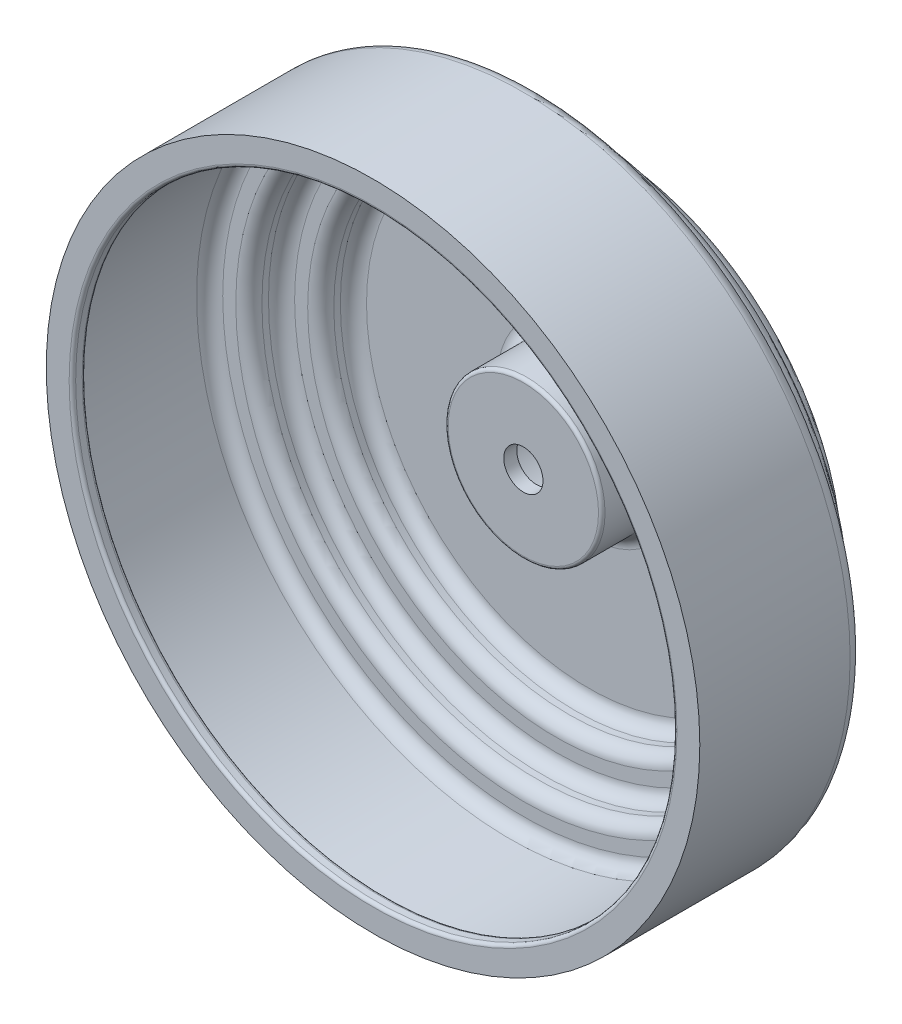
ISO-10303-21;
HEADER;
FILE_DESCRIPTION(('STEP AP214'),'2;1');
FILE_NAME('part.step','',(''),(''),'','','');
FILE_SCHEMA(('AUTOMOTIVE_DESIGN { 1 0 10303 214 1 1 1 1 }'));
ENDSEC;
DATA;
#1=APPLICATION_CONTEXT('core data for automotive mechanical design processes');
#2=APPLICATION_PROTOCOL_DEFINITION('international standard','automotive_design',2000,#1);
#3=PRODUCT_CONTEXT('',#1,'mechanical');
#4=PRODUCT('Part','Part','',(#3));
#5=PRODUCT_RELATED_PRODUCT_CATEGORY('part','',(#4));
#6=PRODUCT_DEFINITION_FORMATION('','',#4);
#7=PRODUCT_DEFINITION_CONTEXT('part definition',#1,'design');
#8=PRODUCT_DEFINITION('design','',#6,#7);
#9=PRODUCT_DEFINITION_SHAPE('','',#8);
#10=(LENGTH_UNIT() NAMED_UNIT(*) SI_UNIT(.MILLI.,.METRE.));
#11=(NAMED_UNIT(*) PLANE_ANGLE_UNIT() SI_UNIT($,.RADIAN.));
#12=(NAMED_UNIT(*) SI_UNIT($,.STERADIAN.) SOLID_ANGLE_UNIT());
#13=UNCERTAINTY_MEASURE_WITH_UNIT(LENGTH_MEASURE(1.E-05),#10,'distance_accuracy_value','');
#14=(GEOMETRIC_REPRESENTATION_CONTEXT(3) GLOBAL_UNCERTAINTY_ASSIGNED_CONTEXT((#13)) GLOBAL_UNIT_ASSIGNED_CONTEXT((#10,
#11,#12)) REPRESENTATION_CONTEXT('',''));
#15=CARTESIAN_POINT('',(0.,0.,0.));
#16=DIRECTION('',(0.,0.,1.));
#17=DIRECTION('',(1.,0.,0.));
#18=AXIS2_PLACEMENT_3D('',#15,#16,#17);
#19=CARTESIAN_POINT('',(0.,-50.,35.));
#20=DIRECTION('',(0.,0.,1.));
#21=DIRECTION('',(1.,0.,0.));
#22=AXIS2_PLACEMENT_3D('',#19,#20,#21);
#23=PLANE('',#22);
#24=CARTESIAN_POINT('',(0.,0.,35.));
#25=DIRECTION('',(0.,0.,1.));
#26=DIRECTION('',(1.,0.,0.));
#27=AXIS2_PLACEMENT_3D('',#24,#25,#26);
#28=CIRCLE('',#27,46.5);
#29=CARTESIAN_POINT('',(46.5,0.,35.));
#30=VERTEX_POINT('',#29);
#31=EDGE_CURVE('E10',#30,#30,#28,.F.);
#32=ORIENTED_EDGE('',*,*,#31,.T.);
#33=EDGE_LOOP('',(#32));
#34=FACE_BOUND('',#33,.T.);
#35=CARTESIAN_POINT('',(0.,0.,35.));
#36=DIRECTION('',(0.,0.,1.));
#37=DIRECTION('',(1.,0.,0.));
#38=AXIS2_PLACEMENT_3D('',#35,#36,#37);
#39=CIRCLE('',#38,50.);
#40=CARTESIAN_POINT('',(50.,0.,35.));
#41=VERTEX_POINT('',#40);
#42=EDGE_CURVE('E149',#41,#41,#39,.T.);
#43=ORIENTED_EDGE('',*,*,#42,.T.);
#44=EDGE_LOOP('',(#43));
#45=FACE_BOUND('',#44,.T.);
#46=ADVANCED_FACE('F39',(#34,#45),#23,.T.);
#47=CARTESIAN_POINT('',(0.,0.,39.2664757959795));
#48=DIRECTION('',(0.,0.,1.));
#49=DIRECTION('',(1.,0.,0.));
#50=AXIS2_PLACEMENT_3D('',#47,#48,#49);
#51=CYLINDRICAL_SURFACE('',#50,46.);
#52=CARTESIAN_POINT('',(0.,0.,33.5));
#53=DIRECTION('',(0.,0.,-1.));
#54=DIRECTION('',(-1.,0.,0.));
#55=AXIS2_PLACEMENT_3D('',#52,#53,#54);
#56=CIRCLE('',#55,46.);
#57=CARTESIAN_POINT('',(-46.,0.,33.5));
#58=VERTEX_POINT('',#57);
#59=EDGE_CURVE('E53',#58,#58,#56,.T.);
#60=ORIENTED_EDGE('',*,*,#59,.T.);
#61=EDGE_LOOP('',(#60));
#62=FACE_BOUND('',#61,.T.);
#63=CARTESIAN_POINT('',(0.,0.,34.5));
#64=DIRECTION('',(0.,0.,1.));
#65=DIRECTION('',(1.,0.,0.));
#66=AXIS2_PLACEMENT_3D('',#63,#64,#65);
#67=CIRCLE('',#66,46.);
#68=CARTESIAN_POINT('',(46.,0.,34.5));
#69=VERTEX_POINT('',#68);
#70=EDGE_CURVE('E56',#69,#69,#67,.T.);
#71=ORIENTED_EDGE('',*,*,#70,.T.);
#72=EDGE_LOOP('',(#71));
#73=FACE_BOUND('',#72,.T.);
#74=ADVANCED_FACE('F172',(#62,#73),#51,.F.);
#75=CARTESIAN_POINT('',(0.,-46.,33.));
#76=DIRECTION('',(0.,0.,-1.));
#77=DIRECTION('',(-1.,0.,0.));
#78=AXIS2_PLACEMENT_3D('',#75,#76,#77);
#79=PLANE('',#78);
#80=CARTESIAN_POINT('',(0.,0.,33.));
#81=DIRECTION('',(0.,0.,-1.));
#82=DIRECTION('',(-1.,0.,0.));
#83=AXIS2_PLACEMENT_3D('',#80,#81,#82);
#84=CIRCLE('',#83,46.5);
#85=CARTESIAN_POINT('',(-46.5,0.,33.));
#86=VERTEX_POINT('',#85);
#87=EDGE_CURVE('E65',#86,#86,#84,.F.);
#88=ORIENTED_EDGE('',*,*,#87,.T.);
#89=EDGE_LOOP('',(#88));
#90=FACE_BOUND('',#89,.T.);
#91=CARTESIAN_POINT('',(0.,0.,33.));
#92=DIRECTION('',(0.,0.,1.));
#93=DIRECTION('',(1.,0.,0.));
#94=AXIS2_PLACEMENT_3D('',#91,#92,#93);
#95=CIRCLE('',#94,48.);
#96=CARTESIAN_POINT('',(48.,0.,33.));
#97=VERTEX_POINT('',#96);
#98=EDGE_CURVE('E140',#97,#97,#95,.T.);
#99=ORIENTED_EDGE('',*,*,#98,.F.);
#100=EDGE_LOOP('',(#99));
#101=FACE_BOUND('',#100,.T.);
#102=ADVANCED_FACE('F180',(#90,#101),#79,.T.);
#103=CARTESIAN_POINT('',(0.,0.,39.2664757959795));
#104=DIRECTION('',(0.,0.,1.));
#105=DIRECTION('',(1.,0.,0.));
#106=AXIS2_PLACEMENT_3D('',#103,#104,#105);
#107=CYLINDRICAL_SURFACE('',#106,48.);
#108=CARTESIAN_POINT('',(0.,0.,14.));
#109=DIRECTION('',(0.,0.,1.));
#110=DIRECTION('',(1.,0.,0.));
#111=AXIS2_PLACEMENT_3D('',#108,#109,#110);
#112=CIRCLE('',#111,48.);
#113=CARTESIAN_POINT('',(48.,0.,14.));
#114=VERTEX_POINT('',#113);
#115=EDGE_CURVE('E90',#114,#114,#112,.F.);
#116=ORIENTED_EDGE('',*,*,#115,.T.);
#117=EDGE_LOOP('',(#116));
#118=FACE_BOUND('',#117,.T.);
#119=ORIENTED_EDGE('',*,*,#98,.T.);
#120=EDGE_LOOP('',(#119));
#121=FACE_BOUND('',#120,.T.);
#122=ADVANCED_FACE('F289',(#118,#121),#107,.F.);
#123=CARTESIAN_POINT('',(0.,-48.,12.));
#124=DIRECTION('',(0.,0.,1.));
#125=DIRECTION('',(1.,0.,0.));
#126=AXIS2_PLACEMENT_3D('',#123,#124,#125);
#127=PLANE('',#126);
#128=CARTESIAN_POINT('',(0.,0.,12.));
#129=DIRECTION('',(0.,0.,1.));
#130=DIRECTION('',(1.,0.,0.));
#131=AXIS2_PLACEMENT_3D('',#128,#129,#130);
#132=CIRCLE('',#131,46.);
#133=CARTESIAN_POINT('',(46.,0.,12.));
#134=VERTEX_POINT('',#133);
#135=EDGE_CURVE('E95',#134,#134,#132,.T.);
#136=ORIENTED_EDGE('',*,*,#135,.T.);
#137=EDGE_LOOP('',(#136));
#138=FACE_BOUND('',#137,.T.);
#139=CARTESIAN_POINT('',(0.,0.,12.));
#140=DIRECTION('',(0.,0.,1.));
#141=DIRECTION('',(1.,0.,0.));
#142=AXIS2_PLACEMENT_3D('',#139,#140,#141);
#143=CIRCLE('',#142,44.);
#144=CARTESIAN_POINT('',(44.,0.,12.));
#145=VERTEX_POINT('',#144);
#146=EDGE_CURVE('E92',#145,#145,#143,.F.);
#147=ORIENTED_EDGE('',*,*,#146,.T.);
#148=EDGE_LOOP('',(#147));
#149=FACE_BOUND('',#148,.T.);
#150=ADVANCED_FACE('F286',(#138,#149),#127,.T.);
#151=CARTESIAN_POINT('',(0.,0.,39.2664757959795));
#152=DIRECTION('',(0.,0.,1.));
#153=DIRECTION('',(1.,0.,0.));
#154=AXIS2_PLACEMENT_3D('',#151,#152,#153);
#155=CYLINDRICAL_SURFACE('',#154,42.);
#156=CARTESIAN_POINT('',(0.,0.,10.));
#157=DIRECTION('',(0.,0.,1.));
#158=DIRECTION('',(1.,0.,0.));
#159=AXIS2_PLACEMENT_3D('',#156,#157,#158);
#160=CIRCLE('',#159,42.);
#161=CARTESIAN_POINT('',(42.,0.,10.));
#162=VERTEX_POINT('',#161);
#163=EDGE_CURVE('E83',#162,#162,#160,.T.);
#164=ORIENTED_EDGE('',*,*,#163,.T.);
#165=EDGE_LOOP('',(#164));
#166=FACE_BOUND('',#165,.T.);
#167=CARTESIAN_POINT('',(0.,0.,8.99999999999999));
#168=DIRECTION('',(0.,0.,1.));
#169=DIRECTION('',(1.,0.,0.));
#170=AXIS2_PLACEMENT_3D('',#167,#168,#169);
#171=CIRCLE('',#170,42.);
#172=CARTESIAN_POINT('',(42.,0.,8.99999999999999));
#173=VERTEX_POINT('',#172);
#174=EDGE_CURVE('E88',#173,#173,#171,.F.);
#175=ORIENTED_EDGE('',*,*,#174,.T.);
#176=EDGE_LOOP('',(#175));
#177=FACE_BOUND('',#176,.T.);
#178=ADVANCED_FACE('F285',(#166,#177),#155,.F.);
#179=CARTESIAN_POINT('',(0.,-42.,6.99999999999999));
#180=DIRECTION('',(0.,0.,1.));
#181=DIRECTION('',(1.,0.,0.));
#182=AXIS2_PLACEMENT_3D('',#179,#180,#181);
#183=PLANE('',#182);
#184=CARTESIAN_POINT('',(0.,0.,6.99999999999999));
#185=DIRECTION('',(0.,0.,1.));
#186=DIRECTION('',(1.,0.,0.));
#187=AXIS2_PLACEMENT_3D('',#184,#185,#186);
#188=CIRCLE('',#187,40.);
#189=CARTESIAN_POINT('',(40.,0.,6.99999999999999));
#190=VERTEX_POINT('',#189);
#191=EDGE_CURVE('E80',#190,#190,#188,.T.);
#192=ORIENTED_EDGE('',*,*,#191,.T.);
#193=EDGE_LOOP('',(#192));
#194=FACE_BOUND('',#193,.T.);
#195=CARTESIAN_POINT('',(0.,0.,6.99999999999999));
#196=DIRECTION('',(0.,0.,1.));
#197=DIRECTION('',(1.,0.,0.));
#198=AXIS2_PLACEMENT_3D('',#195,#196,#197);
#199=CIRCLE('',#198,38.);
#200=CARTESIAN_POINT('',(38.,0.,6.99999999999999));
#201=VERTEX_POINT('',#200);
#202=EDGE_CURVE('E76',#201,#201,#199,.F.);
#203=ORIENTED_EDGE('',*,*,#202,.T.);
#204=EDGE_LOOP('',(#203));
#205=FACE_BOUND('',#204,.T.);
#206=ADVANCED_FACE('F279',(#194,#205),#183,.T.);
#207=CARTESIAN_POINT('',(0.,0.,39.2664757959795));
#208=DIRECTION('',(0.,0.,1.));
#209=DIRECTION('',(1.,0.,0.));
#210=AXIS2_PLACEMENT_3D('',#207,#208,#209);
#211=CYLINDRICAL_SURFACE('',#210,36.);
#212=CARTESIAN_POINT('',(0.,0.,5.));
#213=DIRECTION('',(0.,0.,1.));
#214=DIRECTION('',(1.,0.,0.));
#215=AXIS2_PLACEMENT_3D('',#212,#213,#214);
#216=CIRCLE('',#215,36.);
#217=CARTESIAN_POINT('',(36.,0.,5.));
#218=VERTEX_POINT('',#217);
#219=EDGE_CURVE('E72',#218,#218,#216,.T.);
#220=ORIENTED_EDGE('',*,*,#219,.T.);
#221=EDGE_LOOP('',(#220));
#222=FACE_BOUND('',#221,.T.);
#223=CARTESIAN_POINT('',(0.,0.,4.));
#224=DIRECTION('',(0.,0.,1.));
#225=DIRECTION('',(1.,0.,0.));
#226=AXIS2_PLACEMENT_3D('',#223,#224,#225);
#227=CIRCLE('',#226,36.);
#228=CARTESIAN_POINT('',(36.,0.,4.));
#229=VERTEX_POINT('',#228);
#230=EDGE_CURVE('E74',#229,#229,#227,.F.);
#231=ORIENTED_EDGE('',*,*,#230,.T.);
#232=EDGE_LOOP('',(#231));
#233=FACE_BOUND('',#232,.T.);
#234=ADVANCED_FACE('F273',(#222,#233),#211,.F.);
#235=CARTESIAN_POINT('',(0.,-36.,2.));
#236=DIRECTION('',(0.,0.,1.));
#237=DIRECTION('',(1.,0.,0.));
#238=AXIS2_PLACEMENT_3D('',#235,#236,#237);
#239=PLANE('',#238);
#240=CARTESIAN_POINT('',(0.,0.,2.));
#241=DIRECTION('',(0.,0.,1.));
#242=DIRECTION('',(1.,0.,0.));
#243=AXIS2_PLACEMENT_3D('',#240,#241,#242);
#244=CIRCLE('',#243,14.);
#245=CARTESIAN_POINT('',(14.,0.,2.));
#246=VERTEX_POINT('',#245);
#247=EDGE_CURVE('E126',#246,#246,#244,.F.);
#248=ORIENTED_EDGE('',*,*,#247,.T.);
#249=EDGE_LOOP('',(#248));
#250=FACE_BOUND('',#249,.T.);
#251=CARTESIAN_POINT('',(0.,0.,2.));
#252=DIRECTION('',(0.,0.,1.));
#253=DIRECTION('',(1.,0.,0.));
#254=AXIS2_PLACEMENT_3D('',#251,#252,#253);
#255=CIRCLE('',#254,34.);
#256=CARTESIAN_POINT('',(34.,0.,2.));
#257=VERTEX_POINT('',#256);
#258=EDGE_CURVE('E132',#257,#257,#255,.T.);
#259=ORIENTED_EDGE('',*,*,#258,.T.);
#260=EDGE_LOOP('',(#259));
#261=FACE_BOUND('',#260,.T.);
#262=ADVANCED_FACE('F271',(#250,#261),#239,.T.);
#263=CARTESIAN_POINT('',(0.,0.,39.2664757959795));
#264=DIRECTION('',(0.,0.,1.));
#265=DIRECTION('',(1.,0.,0.));
#266=AXIS2_PLACEMENT_3D('',#263,#264,#265);
#267=CYLINDRICAL_SURFACE('',#266,12.);
#268=CARTESIAN_POINT('',(0.,0.,11.5));
#269=DIRECTION('',(0.,0.,1.));
#270=DIRECTION('',(1.,0.,0.));
#271=AXIS2_PLACEMENT_3D('',#268,#269,#270);
#272=CIRCLE('',#271,12.);
#273=CARTESIAN_POINT('',(12.,0.,11.5));
#274=VERTEX_POINT('',#273);
#275=EDGE_CURVE('E46',#274,#274,#272,.F.);
#276=ORIENTED_EDGE('',*,*,#275,.T.);
#277=EDGE_LOOP('',(#276));
#278=FACE_BOUND('',#277,.T.);
#279=CARTESIAN_POINT('',(0.,0.,4.));
#280=DIRECTION('',(0.,0.,1.));
#281=DIRECTION('',(1.,0.,0.));
#282=AXIS2_PLACEMENT_3D('',#279,#280,#281);
#283=CIRCLE('',#282,12.);
#284=CARTESIAN_POINT('',(12.,0.,4.));
#285=VERTEX_POINT('',#284);
#286=EDGE_CURVE('E134',#285,#285,#283,.T.);
#287=ORIENTED_EDGE('',*,*,#286,.T.);
#288=EDGE_LOOP('',(#287));
#289=FACE_BOUND('',#288,.T.);
#290=ADVANCED_FACE('F242',(#278,#289),#267,.T.);
#291=CARTESIAN_POINT('',(0.,-12.,12.));
#292=DIRECTION('',(0.,0.,1.));
#293=DIRECTION('',(1.,0.,0.));
#294=AXIS2_PLACEMENT_3D('',#291,#292,#293);
#295=PLANE('',#294);
#296=CARTESIAN_POINT('',(0.,0.,12.));
#297=DIRECTION('',(0.,0.,1.));
#298=DIRECTION('',(1.,0.,0.));
#299=AXIS2_PLACEMENT_3D('',#296,#297,#298);
#300=CIRCLE('',#299,11.5);
#301=CARTESIAN_POINT('',(11.5,0.,12.));
#302=VERTEX_POINT('',#301);
#303=EDGE_CURVE('E49',#302,#302,#300,.T.);
#304=ORIENTED_EDGE('',*,*,#303,.T.);
#305=EDGE_LOOP('',(#304));
#306=FACE_BOUND('',#305,.T.);
#307=CARTESIAN_POINT('',(0.,0.,12.));
#308=DIRECTION('',(0.,0.,1.));
#309=DIRECTION('',(1.,0.,0.));
#310=AXIS2_PLACEMENT_3D('',#307,#308,#309);
#311=CIRCLE('',#310,3.);
#312=CARTESIAN_POINT('',(3.,0.,12.));
#313=VERTEX_POINT('',#312);
#314=EDGE_CURVE('E139',#313,#313,#311,.T.);
#315=ORIENTED_EDGE('',*,*,#314,.F.);
#316=EDGE_LOOP('',(#315));
#317=FACE_BOUND('',#316,.T.);
#318=ADVANCED_FACE('F240',(#306,#317),#295,.T.);
#319=CARTESIAN_POINT('',(0.,0.,39.2664757959795));
#320=DIRECTION('',(0.,0.,1.));
#321=DIRECTION('',(1.,0.,0.));
#322=AXIS2_PLACEMENT_3D('',#319,#320,#321);
#323=CYLINDRICAL_SURFACE('',#322,3.);
#324=ORIENTED_EDGE('',*,*,#314,.T.);
#325=EDGE_LOOP('',(#324));
#326=FACE_BOUND('',#325,.T.);
#327=CARTESIAN_POINT('',(0.,0.,10.));
#328=DIRECTION('',(0.,0.,1.));
#329=DIRECTION('',(1.,0.,0.));
#330=AXIS2_PLACEMENT_3D('',#327,#328,#329);
#331=CIRCLE('',#330,3.);
#332=CARTESIAN_POINT('',(3.,0.,10.));
#333=VERTEX_POINT('',#332);
#334=EDGE_CURVE('E141',#333,#333,#331,.T.);
#335=ORIENTED_EDGE('',*,*,#334,.F.);
#336=EDGE_LOOP('',(#335));
#337=FACE_BOUND('',#336,.T.);
#338=ADVANCED_FACE('F238',(#326,#337),#323,.F.);
#339=CARTESIAN_POINT('',(0.,-9.99999999999999,10.));
#340=DIRECTION('',(0.,0.,-1.));
#341=DIRECTION('',(-1.,0.,0.));
#342=AXIS2_PLACEMENT_3D('',#339,#340,#341);
#343=PLANE('',#342);
#344=ORIENTED_EDGE('',*,*,#334,.T.);
#345=EDGE_LOOP('',(#344));
#346=FACE_BOUND('',#345,.T.);
#347=CARTESIAN_POINT('',(0.,0.,10.));
#348=DIRECTION('',(0.,0.,1.));
#349=DIRECTION('',(1.,0.,0.));
#350=AXIS2_PLACEMENT_3D('',#347,#348,#349);
#351=CIRCLE('',#350,9.99999999999999);
#352=CARTESIAN_POINT('',(9.99999999999999,0.,10.));
#353=VERTEX_POINT('',#352);
#354=EDGE_CURVE('E148',#353,#353,#351,.T.);
#355=ORIENTED_EDGE('',*,*,#354,.F.);
#356=EDGE_LOOP('',(#355));
#357=FACE_BOUND('',#356,.T.);
#358=ADVANCED_FACE('F250',(#346,#357),#343,.T.);
#359=CARTESIAN_POINT('',(0.,0.,39.2664757959795));
#360=DIRECTION('',(0.,0.,1.));
#361=DIRECTION('',(1.,0.,0.));
#362=AXIS2_PLACEMENT_3D('',#359,#360,#361);
#363=CYLINDRICAL_SURFACE('',#362,9.99999999999999);
#364=CARTESIAN_POINT('',(0.,0.,0.5));
#365=DIRECTION('',(0.,0.,-1.));
#366=DIRECTION('',(-1.,0.,0.));
#367=AXIS2_PLACEMENT_3D('',#364,#365,#366);
#368=CIRCLE('',#367,9.99999999999999);
#369=CARTESIAN_POINT('',(-9.99999999999999,0.,0.5));
#370=VERTEX_POINT('',#369);
#371=EDGE_CURVE('E61',#370,#370,#368,.T.);
#372=ORIENTED_EDGE('',*,*,#371,.T.);
#373=EDGE_LOOP('',(#372));
#374=FACE_BOUND('',#373,.T.);
#375=ORIENTED_EDGE('',*,*,#354,.T.);
#376=EDGE_LOOP('',(#375));
#377=FACE_BOUND('',#376,.T.);
#378=ADVANCED_FACE('F251',(#374,#377),#363,.F.);
#379=CARTESIAN_POINT('',(0.,-38.,0.));
#380=DIRECTION('',(0.,0.,-1.));
#381=DIRECTION('',(-1.,0.,0.));
#382=AXIS2_PLACEMENT_3D('',#379,#380,#381);
#383=PLANE('',#382);
#384=CARTESIAN_POINT('',(0.,0.,0.));
#385=DIRECTION('',(0.,0.,-1.));
#386=DIRECTION('',(-1.,0.,0.));
#387=AXIS2_PLACEMENT_3D('',#384,#385,#386);
#388=CIRCLE('',#387,10.5);
#389=CARTESIAN_POINT('',(-10.5,0.,0.));
#390=VERTEX_POINT('',#389);
#391=EDGE_CURVE('E68',#390,#390,#388,.F.);
#392=ORIENTED_EDGE('',*,*,#391,.T.);
#393=EDGE_LOOP('',(#392));
#394=FACE_BOUND('',#393,.T.);
#395=CARTESIAN_POINT('',(0.,0.,0.));
#396=DIRECTION('',(0.,0.,-1.));
#397=DIRECTION('',(-1.,0.,0.));
#398=AXIS2_PLACEMENT_3D('',#395,#396,#397);
#399=CIRCLE('',#398,36.);
#400=CARTESIAN_POINT('',(-36.,0.,0.));
#401=VERTEX_POINT('',#400);
#402=EDGE_CURVE('E98',#401,#401,#399,.T.);
#403=ORIENTED_EDGE('',*,*,#402,.T.);
#404=EDGE_LOOP('',(#403));
#405=FACE_BOUND('',#404,.T.);
#406=ADVANCED_FACE('F256',(#394,#405),#383,.T.);
#407=CARTESIAN_POINT('',(0.,0.,39.2664757959795));
#408=DIRECTION('',(0.,0.,1.));
#409=DIRECTION('',(1.,0.,0.));
#410=AXIS2_PLACEMENT_3D('',#407,#408,#409);
#411=CYLINDRICAL_SURFACE('',#410,38.);
#412=CARTESIAN_POINT('',(0.,0.,3.));
#413=DIRECTION('',(0.,0.,-1.));
#414=DIRECTION('',(-1.,0.,0.));
#415=AXIS2_PLACEMENT_3D('',#412,#413,#414);
#416=CIRCLE('',#415,38.);
#417=CARTESIAN_POINT('',(-38.,0.,3.));
#418=VERTEX_POINT('',#417);
#419=EDGE_CURVE('E101',#418,#418,#416,.T.);
#420=ORIENTED_EDGE('',*,*,#419,.T.);
#421=EDGE_LOOP('',(#420));
#422=FACE_BOUND('',#421,.T.);
#423=CARTESIAN_POINT('',(0.,0.,2.));
#424=DIRECTION('',(0.,0.,-1.));
#425=DIRECTION('',(-1.,0.,0.));
#426=AXIS2_PLACEMENT_3D('',#423,#424,#425);
#427=CIRCLE('',#426,38.);
#428=CARTESIAN_POINT('',(-38.,0.,2.));
#429=VERTEX_POINT('',#428);
#430=EDGE_CURVE('E102',#429,#429,#427,.F.);
#431=ORIENTED_EDGE('',*,*,#430,.T.);
#432=EDGE_LOOP('',(#431));
#433=FACE_BOUND('',#432,.T.);
#434=ADVANCED_FACE('F262',(#422,#433),#411,.T.);
#435=CARTESIAN_POINT('',(0.,-44.,5.));
#436=DIRECTION('',(0.,0.,-1.));
#437=DIRECTION('',(-1.,0.,0.));
#438=AXIS2_PLACEMENT_3D('',#435,#436,#437);
#439=PLANE('',#438);
#440=CARTESIAN_POINT('',(0.,0.,5.));
#441=DIRECTION('',(0.,0.,-1.));
#442=DIRECTION('',(-1.,0.,0.));
#443=AXIS2_PLACEMENT_3D('',#440,#441,#442);
#444=CIRCLE('',#443,42.);
#445=CARTESIAN_POINT('',(-42.,0.,5.));
#446=VERTEX_POINT('',#445);
#447=EDGE_CURVE('E110',#446,#446,#444,.T.);
#448=ORIENTED_EDGE('',*,*,#447,.T.);
#449=EDGE_LOOP('',(#448));
#450=FACE_BOUND('',#449,.T.);
#451=CARTESIAN_POINT('',(0.,0.,5.));
#452=DIRECTION('',(0.,0.,-1.));
#453=DIRECTION('',(-1.,0.,0.));
#454=AXIS2_PLACEMENT_3D('',#451,#452,#453);
#455=CIRCLE('',#454,40.);
#456=CARTESIAN_POINT('',(-40.,0.,5.));
#457=VERTEX_POINT('',#456);
#458=EDGE_CURVE('E109',#457,#457,#455,.F.);
#459=ORIENTED_EDGE('',*,*,#458,.T.);
#460=EDGE_LOOP('',(#459));
#461=FACE_BOUND('',#460,.T.);
#462=ADVANCED_FACE('F349',(#450,#461),#439,.T.);
#463=CARTESIAN_POINT('',(0.,0.,39.2664757959795));
#464=DIRECTION('',(0.,0.,1.));
#465=DIRECTION('',(1.,0.,0.));
#466=AXIS2_PLACEMENT_3D('',#463,#464,#465);
#467=CYLINDRICAL_SURFACE('',#466,44.);
#468=CARTESIAN_POINT('',(0.,0.,7.99999999999999));
#469=DIRECTION('',(0.,0.,-1.));
#470=DIRECTION('',(-1.,0.,0.));
#471=AXIS2_PLACEMENT_3D('',#468,#469,#470);
#472=CIRCLE('',#471,44.);
#473=CARTESIAN_POINT('',(-44.,0.,7.99999999999999));
#474=VERTEX_POINT('',#473);
#475=EDGE_CURVE('E114',#474,#474,#472,.T.);
#476=ORIENTED_EDGE('',*,*,#475,.T.);
#477=EDGE_LOOP('',(#476));
#478=FACE_BOUND('',#477,.T.);
#479=CARTESIAN_POINT('',(0.,0.,6.99999999999999));
#480=DIRECTION('',(0.,0.,-1.));
#481=DIRECTION('',(-1.,0.,0.));
#482=AXIS2_PLACEMENT_3D('',#479,#480,#481);
#483=CIRCLE('',#482,44.);
#484=CARTESIAN_POINT('',(-44.,0.,6.99999999999999));
#485=VERTEX_POINT('',#484);
#486=EDGE_CURVE('E117',#485,#485,#483,.F.);
#487=ORIENTED_EDGE('',*,*,#486,.T.);
#488=EDGE_LOOP('',(#487));
#489=FACE_BOUND('',#488,.T.);
#490=ADVANCED_FACE('F170',(#478,#489),#467,.T.);
#491=CARTESIAN_POINT('',(0.,-50.,10.));
#492=DIRECTION('',(0.,0.,-1.));
#493=DIRECTION('',(-1.,0.,0.));
#494=AXIS2_PLACEMENT_3D('',#491,#492,#493);
#495=PLANE('',#494);
#496=CARTESIAN_POINT('',(0.,0.,10.));
#497=DIRECTION('',(0.,0.,-1.));
#498=DIRECTION('',(-1.,0.,0.));
#499=AXIS2_PLACEMENT_3D('',#496,#497,#498);
#500=CIRCLE('',#499,48.);
#501=CARTESIAN_POINT('',(-48.,0.,10.));
#502=VERTEX_POINT('',#501);
#503=EDGE_CURVE('E119',#502,#502,#500,.T.);
#504=ORIENTED_EDGE('',*,*,#503,.T.);
#505=EDGE_LOOP('',(#504));
#506=FACE_BOUND('',#505,.T.);
#507=CARTESIAN_POINT('',(0.,0.,10.));
#508=DIRECTION('',(0.,0.,-1.));
#509=DIRECTION('',(-1.,0.,0.));
#510=AXIS2_PLACEMENT_3D('',#507,#508,#509);
#511=CIRCLE('',#510,46.);
#512=CARTESIAN_POINT('',(-46.,0.,10.));
#513=VERTEX_POINT('',#512);
#514=EDGE_CURVE('E125',#513,#513,#511,.F.);
#515=ORIENTED_EDGE('',*,*,#514,.T.);
#516=EDGE_LOOP('',(#515));
#517=FACE_BOUND('',#516,.T.);
#518=ADVANCED_FACE('F160',(#506,#517),#495,.T.);
#519=CARTESIAN_POINT('',(0.,0.,39.2664757959795));
#520=DIRECTION('',(0.,0.,1.));
#521=DIRECTION('',(1.,0.,0.));
#522=AXIS2_PLACEMENT_3D('',#519,#520,#521);
#523=CYLINDRICAL_SURFACE('',#522,50.);
#524=CARTESIAN_POINT('',(0.,0.,12.));
#525=DIRECTION('',(0.,0.,-1.));
#526=DIRECTION('',(-1.,0.,0.));
#527=AXIS2_PLACEMENT_3D('',#524,#525,#526);
#528=CIRCLE('',#527,50.);
#529=CARTESIAN_POINT('',(-50.,0.,12.));
#530=VERTEX_POINT('',#529);
#531=EDGE_CURVE('E124',#530,#530,#528,.F.);
#532=ORIENTED_EDGE('',*,*,#531,.T.);
#533=EDGE_LOOP('',(#532));
#534=FACE_BOUND('',#533,.T.);
#535=ORIENTED_EDGE('',*,*,#42,.F.);
#536=EDGE_LOOP('',(#535));
#537=FACE_BOUND('',#536,.T.);
#538=ADVANCED_FACE('F152',(#534,#537),#523,.T.);
#539=CARTESIAN_POINT('',(0.,0.,4.));
#540=DIRECTION('',(0.,0.,1.));
#541=DIRECTION('',(1.,0.,0.));
#542=AXIS2_PLACEMENT_3D('',#539,#540,#541);
#543=TOROIDAL_SURFACE('',#542,14.,2.);
#544=ORIENTED_EDGE('',*,*,#247,.F.);
#545=EDGE_LOOP('',(#544));
#546=FACE_BOUND('',#545,.T.);
#547=ORIENTED_EDGE('',*,*,#286,.F.);
#548=EDGE_LOOP('',(#547));
#549=FACE_BOUND('',#548,.T.);
#550=ADVANCED_FACE('F156',(#546,#549),#543,.F.);
#551=CARTESIAN_POINT('',(0.,0.,12.));
#552=DIRECTION('',(0.,0.,-1.));
#553=DIRECTION('',(-1.,0.,0.));
#554=AXIS2_PLACEMENT_3D('',#551,#552,#553);
#555=TOROIDAL_SURFACE('',#554,48.,2.);
#556=ORIENTED_EDGE('',*,*,#503,.F.);
#557=EDGE_LOOP('',(#556));
#558=FACE_BOUND('',#557,.T.);
#559=ORIENTED_EDGE('',*,*,#531,.F.);
#560=EDGE_LOOP('',(#559));
#561=FACE_BOUND('',#560,.T.);
#562=ADVANCED_FACE('F163',(#558,#561),#555,.T.);
#563=CARTESIAN_POINT('',(0.,0.,7.99999999999999));
#564=DIRECTION('',(0.,0.,-1.));
#565=DIRECTION('',(-1.,0.,0.));
#566=AXIS2_PLACEMENT_3D('',#563,#564,#565);
#567=TOROIDAL_SURFACE('',#566,46.,2.);
#568=ORIENTED_EDGE('',*,*,#475,.F.);
#569=EDGE_LOOP('',(#568));
#570=FACE_BOUND('',#569,.T.);
#571=ORIENTED_EDGE('',*,*,#514,.F.);
#572=EDGE_LOOP('',(#571));
#573=FACE_BOUND('',#572,.T.);
#574=ADVANCED_FACE('F184',(#570,#573),#567,.F.);
#575=CARTESIAN_POINT('',(0.,0.,6.99999999999999));
#576=DIRECTION('',(0.,0.,-1.));
#577=DIRECTION('',(-1.,0.,0.));
#578=AXIS2_PLACEMENT_3D('',#575,#576,#577);
#579=TOROIDAL_SURFACE('',#578,42.,2.);
#580=ORIENTED_EDGE('',*,*,#447,.F.);
#581=EDGE_LOOP('',(#580));
#582=FACE_BOUND('',#581,.T.);
#583=ORIENTED_EDGE('',*,*,#486,.F.);
#584=EDGE_LOOP('',(#583));
#585=FACE_BOUND('',#584,.T.);
#586=ADVANCED_FACE('F188',(#582,#585),#579,.T.);
#587=CARTESIAN_POINT('',(0.,0.,3.));
#588=DIRECTION('',(0.,0.,-1.));
#589=DIRECTION('',(-1.,0.,0.));
#590=AXIS2_PLACEMENT_3D('',#587,#588,#589);
#591=TOROIDAL_SURFACE('',#590,40.,2.);
#592=ORIENTED_EDGE('',*,*,#419,.F.);
#593=EDGE_LOOP('',(#592));
#594=FACE_BOUND('',#593,.T.);
#595=ORIENTED_EDGE('',*,*,#458,.F.);
#596=EDGE_LOOP('',(#595));
#597=FACE_BOUND('',#596,.T.);
#598=ADVANCED_FACE('F195',(#594,#597),#591,.F.);
#599=CARTESIAN_POINT('',(0.,0.,2.));
#600=DIRECTION('',(0.,0.,-1.));
#601=DIRECTION('',(-1.,0.,0.));
#602=AXIS2_PLACEMENT_3D('',#599,#600,#601);
#603=TOROIDAL_SURFACE('',#602,36.,2.);
#604=ORIENTED_EDGE('',*,*,#402,.F.);
#605=EDGE_LOOP('',(#604));
#606=FACE_BOUND('',#605,.T.);
#607=ORIENTED_EDGE('',*,*,#430,.F.);
#608=EDGE_LOOP('',(#607));
#609=FACE_BOUND('',#608,.T.);
#610=ADVANCED_FACE('F198',(#606,#609),#603,.T.);
#611=CARTESIAN_POINT('',(0.,0.,14.));
#612=DIRECTION('',(0.,0.,1.));
#613=DIRECTION('',(1.,0.,0.));
#614=AXIS2_PLACEMENT_3D('',#611,#612,#613);
#615=TOROIDAL_SURFACE('',#614,46.,2.);
#616=ORIENTED_EDGE('',*,*,#115,.F.);
#617=EDGE_LOOP('',(#616));
#618=FACE_BOUND('',#617,.T.);
#619=ORIENTED_EDGE('',*,*,#135,.F.);
#620=EDGE_LOOP('',(#619));
#621=FACE_BOUND('',#620,.T.);
#622=ADVANCED_FACE('F199',(#618,#621),#615,.F.);
#623=CARTESIAN_POINT('',(0.,0.,10.));
#624=DIRECTION('',(0.,0.,1.));
#625=DIRECTION('',(1.,0.,0.));
#626=AXIS2_PLACEMENT_3D('',#623,#624,#625);
#627=TOROIDAL_SURFACE('',#626,44.,2.);
#628=ORIENTED_EDGE('',*,*,#146,.F.);
#629=EDGE_LOOP('',(#628));
#630=FACE_BOUND('',#629,.T.);
#631=ORIENTED_EDGE('',*,*,#163,.F.);
#632=EDGE_LOOP('',(#631));
#633=FACE_BOUND('',#632,.T.);
#634=ADVANCED_FACE('F204',(#630,#633),#627,.T.);
#635=CARTESIAN_POINT('',(0.,0.,8.99999999999999));
#636=DIRECTION('',(0.,0.,1.));
#637=DIRECTION('',(1.,0.,0.));
#638=AXIS2_PLACEMENT_3D('',#635,#636,#637);
#639=TOROIDAL_SURFACE('',#638,40.,2.);
#640=ORIENTED_EDGE('',*,*,#174,.F.);
#641=EDGE_LOOP('',(#640));
#642=FACE_BOUND('',#641,.T.);
#643=ORIENTED_EDGE('',*,*,#191,.F.);
#644=EDGE_LOOP('',(#643));
#645=FACE_BOUND('',#644,.T.);
#646=ADVANCED_FACE('F208',(#642,#645),#639,.F.);
#647=CARTESIAN_POINT('',(0.,0.,5.));
#648=DIRECTION('',(0.,0.,1.));
#649=DIRECTION('',(1.,0.,0.));
#650=AXIS2_PLACEMENT_3D('',#647,#648,#649);
#651=TOROIDAL_SURFACE('',#650,38.,2.);
#652=ORIENTED_EDGE('',*,*,#202,.F.);
#653=EDGE_LOOP('',(#652));
#654=FACE_BOUND('',#653,.T.);
#655=ORIENTED_EDGE('',*,*,#219,.F.);
#656=EDGE_LOOP('',(#655));
#657=FACE_BOUND('',#656,.T.);
#658=ADVANCED_FACE('F215',(#654,#657),#651,.T.);
#659=CARTESIAN_POINT('',(0.,0.,4.));
#660=DIRECTION('',(0.,0.,1.));
#661=DIRECTION('',(1.,0.,0.));
#662=AXIS2_PLACEMENT_3D('',#659,#660,#661);
#663=TOROIDAL_SURFACE('',#662,34.,2.);
#664=ORIENTED_EDGE('',*,*,#230,.F.);
#665=EDGE_LOOP('',(#664));
#666=FACE_BOUND('',#665,.T.);
#667=ORIENTED_EDGE('',*,*,#258,.F.);
#668=EDGE_LOOP('',(#667));
#669=FACE_BOUND('',#668,.T.);
#670=ADVANCED_FACE('F216',(#666,#669),#663,.F.);
#671=CARTESIAN_POINT('',(0.,0.,0.5));
#672=DIRECTION('',(0.,0.,-1.));
#673=DIRECTION('',(-1.,0.,0.));
#674=AXIS2_PLACEMENT_3D('',#671,#672,#673);
#675=TOROIDAL_SURFACE('',#674,10.5,0.5);
#676=ORIENTED_EDGE('',*,*,#371,.F.);
#677=EDGE_LOOP('',(#676));
#678=FACE_BOUND('',#677,.T.);
#679=ORIENTED_EDGE('',*,*,#391,.F.);
#680=EDGE_LOOP('',(#679));
#681=FACE_BOUND('',#680,.T.);
#682=ADVANCED_FACE('F218',(#678,#681),#675,.T.);
#683=CARTESIAN_POINT('',(0.,0.,33.5));
#684=DIRECTION('',(0.,0.,-1.));
#685=DIRECTION('',(-1.,0.,0.));
#686=AXIS2_PLACEMENT_3D('',#683,#684,#685);
#687=TOROIDAL_SURFACE('',#686,46.5,0.5);
#688=ORIENTED_EDGE('',*,*,#59,.F.);
#689=EDGE_LOOP('',(#688));
#690=FACE_BOUND('',#689,.T.);
#691=ORIENTED_EDGE('',*,*,#87,.F.);
#692=EDGE_LOOP('',(#691));
#693=FACE_BOUND('',#692,.T.);
#694=ADVANCED_FACE('F224',(#690,#693),#687,.T.);
#695=CARTESIAN_POINT('',(0.,0.,11.5));
#696=DIRECTION('',(0.,0.,1.));
#697=DIRECTION('',(1.,0.,0.));
#698=AXIS2_PLACEMENT_3D('',#695,#696,#697);
#699=TOROIDAL_SURFACE('',#698,11.5,0.5);
#700=ORIENTED_EDGE('',*,*,#275,.F.);
#701=EDGE_LOOP('',(#700));
#702=FACE_BOUND('',#701,.T.);
#703=ORIENTED_EDGE('',*,*,#303,.F.);
#704=EDGE_LOOP('',(#703));
#705=FACE_BOUND('',#704,.T.);
#706=ADVANCED_FACE('F227',(#702,#705),#699,.T.);
#707=CARTESIAN_POINT('',(0.,0.,34.5));
#708=DIRECTION('',(0.,0.,1.));
#709=DIRECTION('',(1.,0.,0.));
#710=AXIS2_PLACEMENT_3D('',#707,#708,#709);
#711=TOROIDAL_SURFACE('',#710,46.5,0.5);
#712=ORIENTED_EDGE('',*,*,#31,.F.);
#713=EDGE_LOOP('',(#712));
#714=FACE_BOUND('',#713,.T.);
#715=ORIENTED_EDGE('',*,*,#70,.F.);
#716=EDGE_LOOP('',(#715));
#717=FACE_BOUND('',#716,.T.);
#718=ADVANCED_FACE('F41',(#714,#717),#711,.T.);
#719=CLOSED_SHELL('',(#46,#74,#102,#122,#150,#178,#206,#234,#262,#290,#318,#338,#358,#378,#406,
#434,#462,#490,#518,#538,#550,#562,#574,#586,#598,#610,#622,#634,#646,#658,#670,#682,#694,#706,#718));
#720=MANIFOLD_SOLID_BREP('B2',#719);
#721=ADVANCED_BREP_SHAPE_REPRESENTATION('',(#18,#720),#14);
#722=SHAPE_DEFINITION_REPRESENTATION(#9,#721);
ENDSEC;
END-ISO-10303-21;
